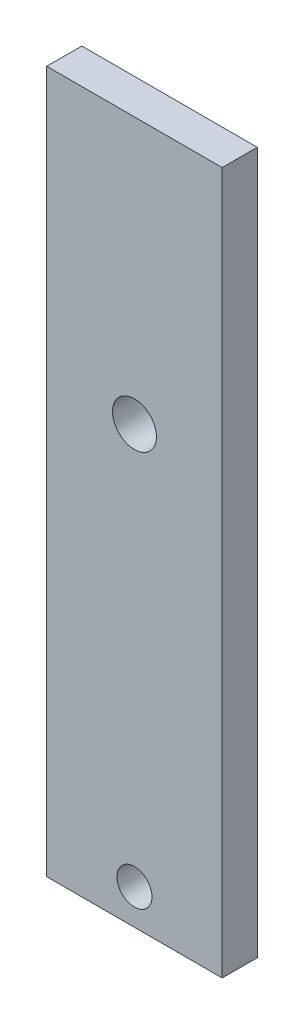
ISO-10303-21;
HEADER;
FILE_DESCRIPTION(('STEP AP214'),'2;1');
FILE_NAME('part.step','',(''),(''),'','','');
FILE_SCHEMA(('AUTOMOTIVE_DESIGN { 1 0 10303 214 1 1 1 1 }'));
ENDSEC;
DATA;
#1=APPLICATION_CONTEXT('core data for automotive mechanical design processes');
#2=APPLICATION_PROTOCOL_DEFINITION('international standard','automotive_design',2000,#1);
#3=PRODUCT_CONTEXT('',#1,'mechanical');
#4=PRODUCT('Part','Part','',(#3));
#5=PRODUCT_RELATED_PRODUCT_CATEGORY('part','',(#4));
#6=PRODUCT_DEFINITION_FORMATION('','',#4);
#7=PRODUCT_DEFINITION_CONTEXT('part definition',#1,'design');
#8=PRODUCT_DEFINITION('design','',#6,#7);
#9=PRODUCT_DEFINITION_SHAPE('','',#8);
#10=(LENGTH_UNIT() NAMED_UNIT(*) SI_UNIT(.MILLI.,.METRE.));
#11=(NAMED_UNIT(*) PLANE_ANGLE_UNIT() SI_UNIT($,.RADIAN.));
#12=(NAMED_UNIT(*) SI_UNIT($,.STERADIAN.) SOLID_ANGLE_UNIT());
#13=UNCERTAINTY_MEASURE_WITH_UNIT(LENGTH_MEASURE(1.E-05),#10,'distance_accuracy_value','');
#14=(GEOMETRIC_REPRESENTATION_CONTEXT(3) GLOBAL_UNCERTAINTY_ASSIGNED_CONTEXT((#13)) GLOBAL_UNIT_ASSIGNED_CONTEXT((#10,
#11,#12)) REPRESENTATION_CONTEXT('',''));
#15=CARTESIAN_POINT('',(0.,0.,0.));
#16=DIRECTION('',(0.,0.,1.));
#17=DIRECTION('',(1.,0.,0.));
#18=AXIS2_PLACEMENT_3D('',#15,#16,#17);
#19=CARTESIAN_POINT('',(5.,-25.,2.));
#20=DIRECTION('',(-1.,0.,0.));
#21=DIRECTION('',(0.,0.,1.));
#22=AXIS2_PLACEMENT_3D('',#19,#20,#21);
#23=PLANE('',#22);
#24=DIRECTION('',(0.,1.,0.));
#25=VECTOR('',#24,1.);
#26=CARTESIAN_POINT('',(5.,-25.,0.));
#27=LINE('',#26,#25);
#28=CARTESIAN_POINT('',(5.,-25.,0.));
#29=VERTEX_POINT('',#28);
#30=CARTESIAN_POINT('',(5.,15.,0.));
#31=VERTEX_POINT('',#30);
#32=EDGE_CURVE('E117',#29,#31,#27,.T.);
#33=ORIENTED_EDGE('',*,*,#32,.T.);
#34=DIRECTION('',(0.,0.,-1.));
#35=VECTOR('',#34,1.);
#36=CARTESIAN_POINT('',(5.,15.,2.));
#37=LINE('',#36,#35);
#38=CARTESIAN_POINT('',(5.,15.,2.));
#39=VERTEX_POINT('',#38);
#40=EDGE_CURVE('E11',#39,#31,#37,.T.);
#41=ORIENTED_EDGE('',*,*,#40,.F.);
#42=DIRECTION('',(0.,1.,0.));
#43=VECTOR('',#42,1.);
#44=CARTESIAN_POINT('',(5.,-25.,2.));
#45=LINE('',#44,#43);
#46=CARTESIAN_POINT('',(5.,-25.,2.));
#47=VERTEX_POINT('',#46);
#48=EDGE_CURVE('E101',#47,#39,#45,.T.);
#49=ORIENTED_EDGE('',*,*,#48,.F.);
#50=DIRECTION('',(0.,0.,-1.));
#51=VECTOR('',#50,1.);
#52=CARTESIAN_POINT('',(5.,-25.,2.));
#53=LINE('',#52,#51);
#54=EDGE_CURVE('E113',#47,#29,#53,.T.);
#55=ORIENTED_EDGE('',*,*,#54,.T.);
#56=EDGE_LOOP('',(#33,#41,#49,#55));
#57=FACE_BOUND('',#56,.T.);
#58=ADVANCED_FACE('F49',(#57),#23,.F.);
#59=CARTESIAN_POINT('',(-5.,15.,2.));
#60=DIRECTION('',(0.,-1.,0.));
#61=DIRECTION('',(0.,0.,-1.));
#62=AXIS2_PLACEMENT_3D('',#59,#60,#61);
#63=PLANE('',#62);
#64=DIRECTION('',(-1.,0.,0.));
#65=VECTOR('',#64,1.);
#66=CARTESIAN_POINT('',(-5.,15.,0.));
#67=LINE('',#66,#65);
#68=CARTESIAN_POINT('',(-5.,15.,0.));
#69=VERTEX_POINT('',#68);
#70=EDGE_CURVE('E106',#31,#69,#67,.T.);
#71=ORIENTED_EDGE('',*,*,#70,.T.);
#72=DIRECTION('',(0.,0.,-1.));
#73=VECTOR('',#72,1.);
#74=CARTESIAN_POINT('',(-5.,15.,2.));
#75=LINE('',#74,#73);
#76=CARTESIAN_POINT('',(-5.,15.,2.));
#77=VERTEX_POINT('',#76);
#78=EDGE_CURVE('E58',#77,#69,#75,.T.);
#79=ORIENTED_EDGE('',*,*,#78,.F.);
#80=DIRECTION('',(-1.,0.,0.));
#81=VECTOR('',#80,1.);
#82=CARTESIAN_POINT('',(-5.,15.,2.));
#83=LINE('',#82,#81);
#84=EDGE_CURVE('E96',#39,#77,#83,.T.);
#85=ORIENTED_EDGE('',*,*,#84,.F.);
#86=ORIENTED_EDGE('',*,*,#40,.T.);
#87=EDGE_LOOP('',(#71,#79,#85,#86));
#88=FACE_BOUND('',#87,.T.);
#89=ADVANCED_FACE('F105',(#88),#63,.F.);
#90=CARTESIAN_POINT('',(-5.,-25.,2.));
#91=DIRECTION('',(1.,0.,0.));
#92=DIRECTION('',(0.,0.,-1.));
#93=AXIS2_PLACEMENT_3D('',#90,#91,#92);
#94=PLANE('',#93);
#95=DIRECTION('',(0.,-1.,0.));
#96=VECTOR('',#95,1.);
#97=CARTESIAN_POINT('',(-5.,-25.,0.));
#98=LINE('',#97,#96);
#99=CARTESIAN_POINT('',(-5.,-25.,0.));
#100=VERTEX_POINT('',#99);
#101=EDGE_CURVE('E83',#69,#100,#98,.T.);
#102=ORIENTED_EDGE('',*,*,#101,.T.);
#103=DIRECTION('',(0.,0.,-1.));
#104=VECTOR('',#103,1.);
#105=CARTESIAN_POINT('',(-5.,-25.,2.));
#106=LINE('',#105,#104);
#107=CARTESIAN_POINT('',(-5.,-25.,2.));
#108=VERTEX_POINT('',#107);
#109=EDGE_CURVE('E108',#108,#100,#106,.T.);
#110=ORIENTED_EDGE('',*,*,#109,.F.);
#111=DIRECTION('',(0.,-1.,0.));
#112=VECTOR('',#111,1.);
#113=CARTESIAN_POINT('',(-5.,-25.,2.));
#114=LINE('',#113,#112);
#115=EDGE_CURVE('E99',#77,#108,#114,.T.);
#116=ORIENTED_EDGE('',*,*,#115,.F.);
#117=ORIENTED_EDGE('',*,*,#78,.T.);
#118=EDGE_LOOP('',(#102,#110,#116,#117));
#119=FACE_BOUND('',#118,.T.);
#120=ADVANCED_FACE('F109',(#119),#94,.F.);
#121=CARTESIAN_POINT('',(-5.,-25.,2.));
#122=DIRECTION('',(0.,1.,0.));
#123=DIRECTION('',(0.,0.,1.));
#124=AXIS2_PLACEMENT_3D('',#121,#122,#123);
#125=PLANE('',#124);
#126=DIRECTION('',(1.,0.,0.));
#127=VECTOR('',#126,1.);
#128=CARTESIAN_POINT('',(-5.,-25.,0.));
#129=LINE('',#128,#127);
#130=EDGE_CURVE('E89',#100,#29,#129,.T.);
#131=ORIENTED_EDGE('',*,*,#130,.T.);
#132=ORIENTED_EDGE('',*,*,#54,.F.);
#133=DIRECTION('',(1.,0.,0.));
#134=VECTOR('',#133,1.);
#135=CARTESIAN_POINT('',(-5.,-25.,2.));
#136=LINE('',#135,#134);
#137=EDGE_CURVE('E66',#108,#47,#136,.T.);
#138=ORIENTED_EDGE('',*,*,#137,.F.);
#139=ORIENTED_EDGE('',*,*,#109,.T.);
#140=EDGE_LOOP('',(#131,#132,#138,#139));
#141=FACE_BOUND('',#140,.T.);
#142=ADVANCED_FACE('F131',(#141),#125,.F.);
#143=CARTESIAN_POINT('',(0.,0.,2.));
#144=DIRECTION('',(0.,0.,-1.));
#145=DIRECTION('',(-1.,0.,0.));
#146=AXIS2_PLACEMENT_3D('',#143,#144,#145);
#147=PLANE('',#146);
#148=CARTESIAN_POINT('',(0.,-23.,2.));
#149=DIRECTION('',(0.,0.,1.));
#150=DIRECTION('',(1.,0.,0.));
#151=AXIS2_PLACEMENT_3D('',#148,#149,#150);
#152=CIRCLE('',#151,1.);
#153=CARTESIAN_POINT('',(1.,-23.,2.));
#154=VERTEX_POINT('',#153);
#155=EDGE_CURVE('E145',#154,#154,#152,.T.);
#156=ORIENTED_EDGE('',*,*,#155,.F.);
#157=EDGE_LOOP('',(#156));
#158=FACE_BOUND('',#157,.T.);
#159=CARTESIAN_POINT('',(0.,-0.164876805448119,2.));
#160=DIRECTION('',(0.,0.,1.));
#161=DIRECTION('',(1.,0.,0.));
#162=AXIS2_PLACEMENT_3D('',#159,#160,#161);
#163=CIRCLE('',#162,1.24999999999999);
#164=CARTESIAN_POINT('',(1.24999999999999,-0.164876805448119,2.));
#165=VERTEX_POINT('',#164);
#166=EDGE_CURVE('E141',#165,#165,#163,.T.);
#167=ORIENTED_EDGE('',*,*,#166,.F.);
#168=EDGE_LOOP('',(#167));
#169=FACE_BOUND('',#168,.T.);
#170=ORIENTED_EDGE('',*,*,#48,.T.);
#171=ORIENTED_EDGE('',*,*,#84,.T.);
#172=ORIENTED_EDGE('',*,*,#115,.T.);
#173=ORIENTED_EDGE('',*,*,#137,.T.);
#174=EDGE_LOOP('',(#170,#171,#172,#173));
#175=FACE_BOUND('',#174,.T.);
#176=ADVANCED_FACE('F97',(#158,#169,#175),#147,.F.);
#177=CARTESIAN_POINT('',(0.,0.,0.));
#178=DIRECTION('',(0.,0.,-1.));
#179=DIRECTION('',(-1.,0.,0.));
#180=AXIS2_PLACEMENT_3D('',#177,#178,#179);
#181=PLANE('',#180);
#182=CARTESIAN_POINT('',(0.,-23.,0.));
#183=DIRECTION('',(0.,0.,-1.));
#184=DIRECTION('',(-1.,0.,0.));
#185=AXIS2_PLACEMENT_3D('',#182,#183,#184);
#186=CIRCLE('',#185,1.);
#187=CARTESIAN_POINT('',(-0.999999999999998,-23.,0.));
#188=VERTEX_POINT('',#187);
#189=EDGE_CURVE('E146',#188,#188,#186,.F.);
#190=ORIENTED_EDGE('',*,*,#189,.T.);
#191=EDGE_LOOP('',(#190));
#192=FACE_BOUND('',#191,.T.);
#193=CARTESIAN_POINT('',(0.,-0.164876805448119,0.));
#194=DIRECTION('',(0.,0.,1.));
#195=DIRECTION('',(1.,0.,0.));
#196=AXIS2_PLACEMENT_3D('',#193,#194,#195);
#197=CIRCLE('',#196,1.25);
#198=CARTESIAN_POINT('',(1.25,-0.164876805448119,0.));
#199=VERTEX_POINT('',#198);
#200=EDGE_CURVE('E121',#199,#199,#197,.T.);
#201=ORIENTED_EDGE('',*,*,#200,.T.);
#202=EDGE_LOOP('',(#201));
#203=FACE_BOUND('',#202,.T.);
#204=ORIENTED_EDGE('',*,*,#32,.F.);
#205=ORIENTED_EDGE('',*,*,#130,.F.);
#206=ORIENTED_EDGE('',*,*,#101,.F.);
#207=ORIENTED_EDGE('',*,*,#70,.F.);
#208=EDGE_LOOP('',(#204,#205,#206,#207));
#209=FACE_BOUND('',#208,.T.);
#210=ADVANCED_FACE('F134',(#192,#203,#209),#181,.T.);
#211=CARTESIAN_POINT('',(0.,-0.164876805448119,2.));
#212=DIRECTION('',(0.,0.,1.));
#213=DIRECTION('',(1.,0.,0.));
#214=AXIS2_PLACEMENT_3D('',#211,#212,#213);
#215=CYLINDRICAL_SURFACE('',#214,1.24999999999999);
#216=ORIENTED_EDGE('',*,*,#200,.F.);
#217=EDGE_LOOP('',(#216));
#218=FACE_BOUND('',#217,.T.);
#219=ORIENTED_EDGE('',*,*,#166,.T.);
#220=EDGE_LOOP('',(#219));
#221=FACE_BOUND('',#220,.T.);
#222=ADVANCED_FACE('F161',(#218,#221),#215,.F.);
#223=CARTESIAN_POINT('',(0.,-23.,-0.00100000000000013));
#224=DIRECTION('',(0.,0.,1.));
#225=DIRECTION('',(1.,0.,0.));
#226=AXIS2_PLACEMENT_3D('',#223,#224,#225);
#227=CYLINDRICAL_SURFACE('',#226,1.);
#228=ORIENTED_EDGE('',*,*,#189,.F.);
#229=EDGE_LOOP('',(#228));
#230=FACE_BOUND('',#229,.T.);
#231=ORIENTED_EDGE('',*,*,#155,.T.);
#232=EDGE_LOOP('',(#231));
#233=FACE_BOUND('',#232,.T.);
#234=ADVANCED_FACE('F154',(#230,#233),#227,.F.);
#235=CLOSED_SHELL('',(#58,#89,#120,#142,#176,#210,#222,#234));
#236=MANIFOLD_SOLID_BREP('B2',#235);
#237=ADVANCED_BREP_SHAPE_REPRESENTATION('',(#18,#236),#14);
#238=SHAPE_DEFINITION_REPRESENTATION(#9,#237);
ENDSEC;
END-ISO-10303-21;
